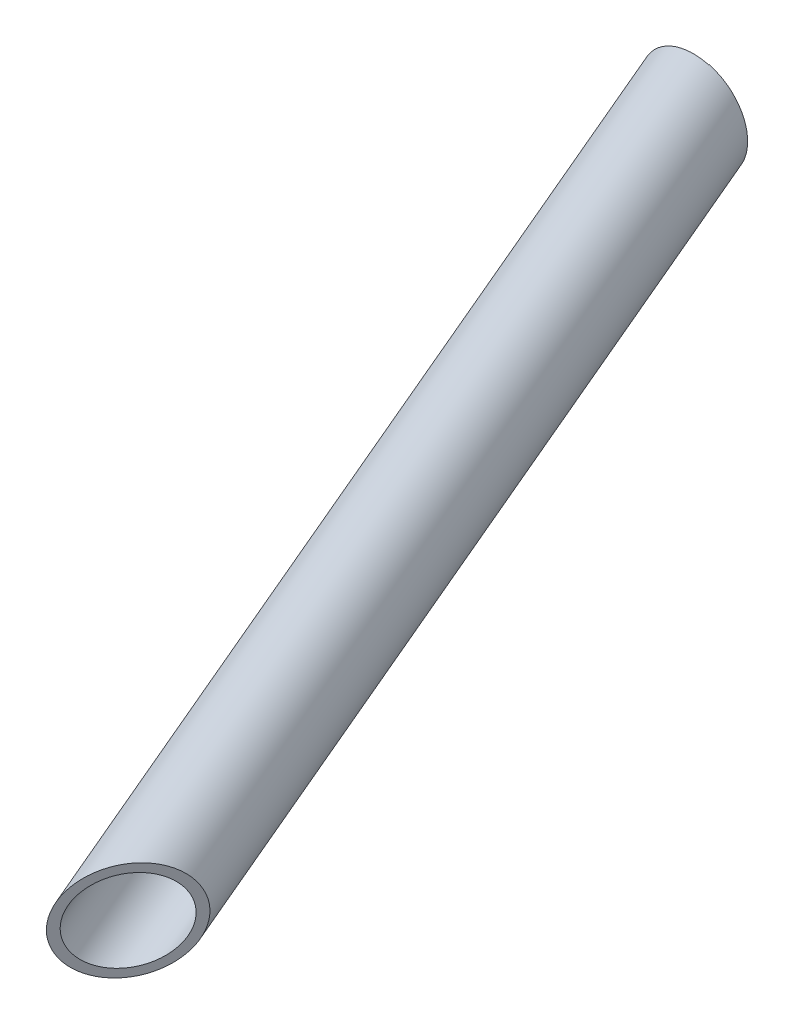
ISO-10303-21;
HEADER;
FILE_DESCRIPTION(('STEP AP214'),'2;1');
FILE_NAME('part.step','',(''),(''),'','','');
FILE_SCHEMA(('AUTOMOTIVE_DESIGN { 1 0 10303 214 1 1 1 1 }'));
ENDSEC;
DATA;
#1=APPLICATION_CONTEXT('core data for automotive mechanical design processes');
#2=APPLICATION_PROTOCOL_DEFINITION('international standard','automotive_design',2000,#1);
#3=PRODUCT_CONTEXT('',#1,'mechanical');
#4=PRODUCT('Part','Part','',(#3));
#5=PRODUCT_RELATED_PRODUCT_CATEGORY('part','',(#4));
#6=PRODUCT_DEFINITION_FORMATION('','',#4);
#7=PRODUCT_DEFINITION_CONTEXT('part definition',#1,'design');
#8=PRODUCT_DEFINITION('design','',#6,#7);
#9=PRODUCT_DEFINITION_SHAPE('','',#8);
#10=(LENGTH_UNIT() NAMED_UNIT(*) SI_UNIT(.MILLI.,.METRE.));
#11=(NAMED_UNIT(*) PLANE_ANGLE_UNIT() SI_UNIT($,.RADIAN.));
#12=(NAMED_UNIT(*) SI_UNIT($,.STERADIAN.) SOLID_ANGLE_UNIT());
#13=UNCERTAINTY_MEASURE_WITH_UNIT(LENGTH_MEASURE(1.E-05),#10,'distance_accuracy_value','');
#14=(GEOMETRIC_REPRESENTATION_CONTEXT(3) GLOBAL_UNCERTAINTY_ASSIGNED_CONTEXT((#13)) GLOBAL_UNIT_ASSIGNED_CONTEXT((#10,
#11,#12)) REPRESENTATION_CONTEXT('',''));
#15=CARTESIAN_POINT('',(0.,0.,0.));
#16=DIRECTION('',(0.,0.,1.));
#17=DIRECTION('',(1.,0.,0.));
#18=AXIS2_PLACEMENT_3D('',#15,#16,#17);
#19=CARTESIAN_POINT('',(-150.,0.,-200.));
#20=DIRECTION('',(0.391140640344852,0.,0.920330918458474));
#21=DIRECTION('',(0.920330918458475,0.,-0.391140640344852));
#22=AXIS2_PLACEMENT_3D('',#19,#20,#21);
#23=CYLINDRICAL_SURFACE('',#22,7.9);
#24=CARTESIAN_POINT('',(-145.733321700332,0.,-189.960756941956));
#25=DIRECTION('',(0.00908676337012188,0.0034075362637957,-0.999952908605234));
#26=DIRECTION('',(0.9999279017278,0.00781928782488758,0.0091131818894493));
#27=AXIS2_PLACEMENT_3D('',#24,#25,#26);
#28=ELLIPSE('',#27,8.61755468254676,7.9);
#29=CARTESIAN_POINT('',(-138.071732025184,-3.60643233113672,-189.903424238614));
#30=VERTEX_POINT('',#29);
#31=CARTESIAN_POINT('',(-147.127731651569,-7.79758004274669,-190.));
#32=VERTEX_POINT('',#31);
#33=EDGE_CURVE('E124',#30,#32,#28,.T.);
#34=ORIENTED_EDGE('',*,*,#33,.T.);
#35=CARTESIAN_POINT('',(-145.75,0.,-190.));
#36=DIRECTION('',(0.,0.,-1.));
#37=DIRECTION('',(1.,0.,0.));
#38=AXIS2_PLACEMENT_3D('',#35,#36,#37);
#39=ELLIPSE('',#38,8.58386895577979,7.9);
#40=CARTESIAN_POINT('',(-152.060201983809,5.35567417656024,-190.));
#41=VERTEX_POINT('',#40);
#42=EDGE_CURVE('E58',#32,#41,#39,.T.);
#43=ORIENTED_EDGE('',*,*,#42,.T.);
#44=CARTESIAN_POINT('',(-142.11438267771,7.17396940893314,-189.903424238614));
#45=VERTEX_POINT('',#44);
#46=EDGE_CURVE('E123',#41,#45,#28,.T.);
#47=ORIENTED_EDGE('',*,*,#46,.T.);
#48=CARTESIAN_POINT('',(-139.573771573539,0.,-175.467697820092));
#49=DIRECTION('',(-0.936285084522112,-0.351106906695792,-0.00970466753338269));
#50=DIRECTION('',(0.0430358521706009,-0.142096139689389,0.988916883521221));
#51=AXIS2_PLACEMENT_3D('',#48,#49,#50);
#52=ELLIPSE('',#51,21.0582067095915,7.9);
#53=CARTESIAN_POINT('',(-142.105343222372,7.15253356872245,-190.));
#54=VERTEX_POINT('',#53);
#55=EDGE_CURVE('E127',#45,#54,#52,.T.);
#56=ORIENTED_EDGE('',*,*,#55,.T.);
#57=CARTESIAN_POINT('',(-145.75,0.,-190.));
#58=DIRECTION('',(0.,0.,-1.));
#59=DIRECTION('',(1.,0.,0.));
#60=AXIS2_PLACEMENT_3D('',#57,#58,#59);
#61=ELLIPSE('',#60,8.58386895577979,7.9);
#62=CARTESIAN_POINT('',(-138.087719578306,-3.56112948211945,-190.));
#63=VERTEX_POINT('',#62);
#64=EDGE_CURVE('E87',#54,#63,#61,.T.);
#65=ORIENTED_EDGE('',*,*,#64,.T.);
#66=EDGE_CURVE('E128',#63,#30,#52,.T.);
#67=ORIENTED_EDGE('',*,*,#66,.T.);
#68=EDGE_LOOP('',(#34,#43,#47,#56,#65,#67));
#69=FACE_BOUND('',#68,.T.);
#70=CARTESIAN_POINT('',(-65.,0.,0.));
#71=DIRECTION('',(0.834008585191079,0.,0.551751465632466));
#72=DIRECTION('',(-0.551751465632466,0.,0.83400858519108));
#73=AXIS2_PLACEMENT_3D('',#70,#71,#72);
#74=ELLIPSE('',#73,9.47232455429705,7.9);
#75=CARTESIAN_POINT('',(-70.2263689557798,0.,7.90000000000001));
#76=VERTEX_POINT('',#75);
#77=EDGE_CURVE('E43',#76,#76,#74,.T.);
#78=ORIENTED_EDGE('',*,*,#77,.T.);
#79=EDGE_LOOP('',(#78));
#80=FACE_BOUND('',#79,.T.);
#81=ADVANCED_FACE('F39',(#69,#80),#23,.F.);
#82=CARTESIAN_POINT('',(-150.,0.,-200.));
#83=DIRECTION('',(0.391140640344852,0.,0.920330918458474));
#84=DIRECTION('',(0.920330918458475,0.,-0.391140640344852));
#85=AXIS2_PLACEMENT_3D('',#82,#83,#84);
#86=CYLINDRICAL_SURFACE('',#85,9.5);
#87=CARTESIAN_POINT('',(-145.75,0.,-190.));
#88=DIRECTION('',(0.,0.,-1.));
#89=DIRECTION('',(1.,0.,0.));
#90=AXIS2_PLACEMENT_3D('',#87,#88,#89);
#91=ELLIPSE('',#90,10.3223740607478,9.5);
#92=CARTESIAN_POINT('',(-146.498707617223,-9.4749774676694,-190.));
#93=VERTEX_POINT('',#92);
#94=CARTESIAN_POINT('',(-152.689226018155,7.03307160148295,-190.));
#95=VERTEX_POINT('',#94);
#96=EDGE_CURVE('E133',#93,#95,#91,.T.);
#97=ORIENTED_EDGE('',*,*,#96,.F.);
#98=CARTESIAN_POINT('',(-145.733321700332,0.,-189.960756941956));
#99=DIRECTION('',(0.00908676337012188,0.0034075362637957,-0.999952908605234));
#100=DIRECTION('',(0.9999279017278,0.00781928782488758,0.0091131818894493));
#101=AXIS2_PLACEMENT_3D('',#98,#99,#100);
#102=ELLIPSE('',#101,10.3628822131891,9.5);
#103=CARTESIAN_POINT('',(-137.339138380588,-5.56001538339157,-189.903424238614));
#104=VERTEX_POINT('',#103);
#105=EDGE_CURVE('E134',#104,#93,#102,.T.);
#106=ORIENTED_EDGE('',*,*,#105,.F.);
#107=CARTESIAN_POINT('',(-139.573771573539,0.,-175.467697820092));
#108=DIRECTION('',(-0.936285084522112,-0.351106906695792,-0.00970466753338269));
#109=DIRECTION('',(0.0430358521706009,-0.142096139689389,0.988916883521221));
#110=AXIS2_PLACEMENT_3D('',#107,#108,#109);
#111=ELLIPSE('',#110,25.3231599672303,9.5);
#112=CARTESIAN_POINT('',(-137.351783951155,-5.52362448785559,-190.));
#113=VERTEX_POINT('',#112);
#114=EDGE_CURVE('E112',#113,#104,#111,.T.);
#115=ORIENTED_EDGE('',*,*,#114,.F.);
#116=CARTESIAN_POINT('',(-145.75,0.,-190.));
#117=DIRECTION('',(0.,0.,-1.));
#118=DIRECTION('',(1.,0.,0.));
#119=AXIS2_PLACEMENT_3D('',#116,#117,#118);
#120=ELLIPSE('',#119,10.3223740607478,9.5);
#121=CARTESIAN_POINT('',(-142.841278849523,9.1150285744586,-190.));
#122=VERTEX_POINT('',#121);
#123=EDGE_CURVE('E99',#122,#113,#120,.T.);
#124=ORIENTED_EDGE('',*,*,#123,.F.);
#125=CARTESIAN_POINT('',(-142.846976322305,9.12755246118799,-189.903424238614));
#126=VERTEX_POINT('',#125);
#127=EDGE_CURVE('E105',#126,#122,#111,.T.);
#128=ORIENTED_EDGE('',*,*,#127,.F.);
#129=EDGE_CURVE('E111',#95,#126,#102,.T.);
#130=ORIENTED_EDGE('',*,*,#129,.F.);
#131=EDGE_LOOP('',(#97,#106,#115,#124,#128,#130));
#132=FACE_BOUND('',#131,.T.);
#133=CARTESIAN_POINT('',(-65.,0.,0.));
#134=DIRECTION('',(0.834008585191079,0.,0.551751465632466));
#135=DIRECTION('',(-0.551751465632466,0.,0.83400858519108));
#136=AXIS2_PLACEMENT_3D('',#133,#134,#135);
#137=ELLIPSE('',#136,11.3907700336483,9.5);
#138=CARTESIAN_POINT('',(-71.2848740607479,0.,9.5));
#139=VERTEX_POINT('',#138);
#140=EDGE_CURVE('E11',#139,#139,#137,.T.);
#141=ORIENTED_EDGE('',*,*,#140,.F.);
#142=EDGE_LOOP('',(#141));
#143=FACE_BOUND('',#142,.T.);
#144=ADVANCED_FACE('F116',(#132,#143),#86,.T.);
#145=CARTESIAN_POINT('',(150.,-10.,-190.));
#146=DIRECTION('',(0.,0.,-1.));
#147=DIRECTION('',(-1.,0.,0.));
#148=AXIS2_PLACEMENT_3D('',#145,#146,#147);
#149=PLANE('',#148);
#150=DIRECTION('',(-0.351123441588392,0.936329177569045,0.));
#151=VECTOR('',#150,1.);
#152=CARTESIAN_POINT('',(-100.453166583322,-103.919937468746,-190.));
#153=LINE('',#152,#151);
#154=EDGE_CURVE('E95',#54,#122,#153,.T.);
#155=ORIENTED_EDGE('',*,*,#154,.T.);
#156=ORIENTED_EDGE('',*,*,#123,.T.);
#157=EDGE_CURVE('E92',#113,#63,#153,.T.);
#158=ORIENTED_EDGE('',*,*,#157,.T.);
#159=ORIENTED_EDGE('',*,*,#64,.F.);
#160=EDGE_LOOP('',(#155,#156,#158,#159));
#161=FACE_BOUND('',#160,.T.);
#162=ADVANCED_FACE('F97',(#161),#149,.T.);
#163=CARTESIAN_POINT('',(-215.72801678848,203.47699370432,-189.903424238614));
#164=DIRECTION('',(-0.936285084522112,-0.351106906695792,-0.00970466753338269));
#165=DIRECTION('',(0.351123441588392,-0.936329177569045,0.));
#166=AXIS2_PLACEMENT_3D('',#163,#164,#165);
#167=PLANE('',#166);
#168=ORIENTED_EDGE('',*,*,#157,.F.);
#169=ORIENTED_EDGE('',*,*,#114,.T.);
#170=DIRECTION('',(0.351123441588392,-0.936329177569044,0.));
#171=VECTOR('',#170,1.);
#172=CARTESIAN_POINT('',(-215.72801678848,203.47699370432,-189.903424238614));
#173=LINE('',#172,#171);
#174=EDGE_CURVE('E135',#30,#104,#173,.T.);
#175=ORIENTED_EDGE('',*,*,#174,.F.);
#176=ORIENTED_EDGE('',*,*,#66,.F.);
#177=EDGE_LOOP('',(#168,#169,#175,#176));
#178=FACE_BOUND('',#177,.T.);
#179=ADVANCED_FACE('F149',(#178),#167,.T.);
#180=EDGE_CURVE('E108',#126,#45,#173,.T.);
#181=ORIENTED_EDGE('',*,*,#180,.F.);
#182=ORIENTED_EDGE('',*,*,#127,.T.);
#183=ORIENTED_EDGE('',*,*,#154,.F.);
#184=ORIENTED_EDGE('',*,*,#55,.F.);
#185=EDGE_LOOP('',(#181,#182,#183,#184));
#186=FACE_BOUND('',#185,.T.);
#187=ADVANCED_FACE('F106',(#186),#167,.T.);
#188=CARTESIAN_POINT('',(-215.72801678848,203.47699370432,-189.903424238614));
#189=DIRECTION('',(0.00908676337012188,0.0034075362637957,-0.999952908605234));
#190=DIRECTION('',(-0.999958714034088,0.,-0.00908681612516445));
#191=AXIS2_PLACEMENT_3D('',#188,#189,#190);
#192=PLANE('',#191);
#193=DIRECTION('',(0.351123441588392,-0.936329177569045,0.));
#194=VECTOR('',#193,1.);
#195=CARTESIAN_POINT('',(-109.771462283922,-107.414298356471,-190.));
#196=LINE('',#195,#194);
#197=EDGE_CURVE('E49',#95,#41,#196,.T.);
#198=ORIENTED_EDGE('',*,*,#197,.F.);
#199=ORIENTED_EDGE('',*,*,#129,.T.);
#200=ORIENTED_EDGE('',*,*,#180,.T.);
#201=ORIENTED_EDGE('',*,*,#46,.F.);
#202=EDGE_LOOP('',(#198,#199,#200,#201));
#203=FACE_BOUND('',#202,.T.);
#204=ADVANCED_FACE('F157',(#203),#192,.T.);
#205=ORIENTED_EDGE('',*,*,#174,.T.);
#206=ORIENTED_EDGE('',*,*,#105,.T.);
#207=EDGE_CURVE('E132',#32,#93,#196,.T.);
#208=ORIENTED_EDGE('',*,*,#207,.F.);
#209=ORIENTED_EDGE('',*,*,#33,.F.);
#210=EDGE_LOOP('',(#205,#206,#208,#209));
#211=FACE_BOUND('',#210,.T.);
#212=ADVANCED_FACE('F147',(#211),#192,.T.);
#213=ORIENTED_EDGE('',*,*,#207,.T.);
#214=ORIENTED_EDGE('',*,*,#96,.T.);
#215=ORIENTED_EDGE('',*,*,#197,.T.);
#216=ORIENTED_EDGE('',*,*,#42,.F.);
#217=EDGE_LOOP('',(#213,#214,#215,#216));
#218=FACE_BOUND('',#217,.T.);
#219=ADVANCED_FACE('F143',(#218),#149,.T.);
#220=CARTESIAN_POINT('',(-65.,0.,0.));
#221=DIRECTION('',(0.834008585191079,0.,0.551751465632466));
#222=DIRECTION('',(0.551751465632466,0.,-0.83400858519108));
#223=AXIS2_PLACEMENT_3D('',#220,#221,#222);
#224=PLANE('',#223);
#225=ORIENTED_EDGE('',*,*,#77,.F.);
#226=EDGE_LOOP('',(#225));
#227=FACE_BOUND('',#226,.T.);
#228=ORIENTED_EDGE('',*,*,#140,.T.);
#229=EDGE_LOOP('',(#228));
#230=FACE_BOUND('',#229,.T.);
#231=ADVANCED_FACE('F41',(#227,#230),#224,.T.);
#232=CLOSED_SHELL('',(#81,#144,#162,#179,#187,#204,#212,#219,#231));
#233=MANIFOLD_SOLID_BREP('B2',#232);
#234=ADVANCED_BREP_SHAPE_REPRESENTATION('',(#18,#233),#14);
#235=SHAPE_DEFINITION_REPRESENTATION(#9,#234);
ENDSEC;
END-ISO-10303-21;
